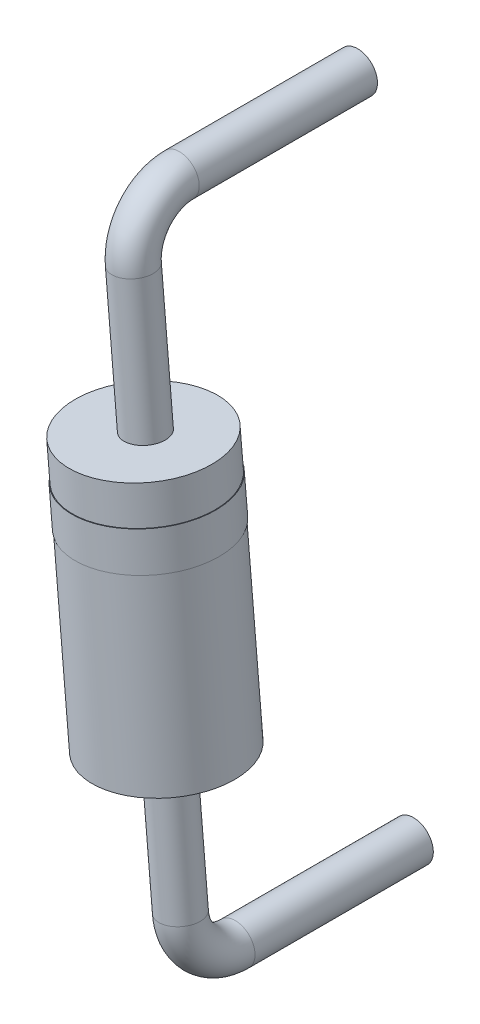
ISO-10303-21;
HEADER;
FILE_DESCRIPTION(('STEP AP214'),'2;1');
FILE_NAME('part.step','',(''),(''),'','','');
FILE_SCHEMA(('AUTOMOTIVE_DESIGN { 1 0 10303 214 1 1 1 1 }'));
ENDSEC;
DATA;
#1=APPLICATION_CONTEXT('core data for automotive mechanical design processes');
#2=APPLICATION_PROTOCOL_DEFINITION('international standard','automotive_design',2000,#1);
#3=PRODUCT_CONTEXT('',#1,'mechanical');
#4=PRODUCT('Part','Part','',(#3));
#5=PRODUCT_RELATED_PRODUCT_CATEGORY('part','',(#4));
#6=PRODUCT_DEFINITION_FORMATION('','',#4);
#7=PRODUCT_DEFINITION_CONTEXT('part definition',#1,'design');
#8=PRODUCT_DEFINITION('design','',#6,#7);
#9=PRODUCT_DEFINITION_SHAPE('','',#8);
#10=(LENGTH_UNIT() NAMED_UNIT(*) SI_UNIT(.MILLI.,.METRE.));
#11=(NAMED_UNIT(*) PLANE_ANGLE_UNIT() SI_UNIT($,.RADIAN.));
#12=(NAMED_UNIT(*) SI_UNIT($,.STERADIAN.) SOLID_ANGLE_UNIT());
#13=UNCERTAINTY_MEASURE_WITH_UNIT(LENGTH_MEASURE(1.E-05),#10,'distance_accuracy_value','');
#14=(GEOMETRIC_REPRESENTATION_CONTEXT(3) GLOBAL_UNCERTAINTY_ASSIGNED_CONTEXT((#13)) GLOBAL_UNIT_ASSIGNED_CONTEXT((#10,
#11,#12)) REPRESENTATION_CONTEXT('',''));
#15=CARTESIAN_POINT('',(0.,0.,0.));
#16=DIRECTION('',(0.,0.,1.));
#17=DIRECTION('',(1.,0.,0.));
#18=AXIS2_PLACEMENT_3D('',#15,#16,#17);
#19=CARTESIAN_POINT('',(51.2695777301861,25.7935231219083,0.3727));
#20=DIRECTION('',(0.996194698091747,0.087155742747638,0.));
#21=DIRECTION('',(0.,0.,1.));
#22=AXIS2_PLACEMENT_3D('',#19,#20,#21);
#23=TOROIDAL_SURFACE('',#22,1.,0.3935);
#24=CARTESIAN_POINT('',(51.1824219874384,26.7897178200001,0.3727));
#25=DIRECTION('',(0.,0.,-1.));
#26=DIRECTION('',(-0.087155742747638,0.996194698091747,0.));
#27=AXIS2_PLACEMENT_3D('',#24,#25,#26);
#28=CIRCLE('',#27,0.3935);
#29=CARTESIAN_POINT('',(51.2167177722096,26.397715206301,0.3727));
#30=VERTEX_POINT('',#29);
#31=EDGE_CURVE('E20',#30,#30,#28,.T.);
#32=ORIENTED_EDGE('',*,*,#31,.F.);
#33=EDGE_LOOP('',(#32));
#34=FACE_BOUND('',#33,.T.);
#35=CARTESIAN_POINT('',(51.2695777301861,25.7935231219083,1.3727));
#36=DIRECTION('',(-0.087155742747638,0.996194698091747,0.));
#37=DIRECTION('',(0.,0.,1.));
#38=AXIS2_PLACEMENT_3D('',#35,#36,#37);
#39=CIRCLE('',#38,0.3935);
#40=CARTESIAN_POINT('',(51.2695777301861,25.7935231219083,0.9792));
#41=VERTEX_POINT('',#40);
#42=EDGE_CURVE('E11',#41,#41,#39,.T.);
#43=ORIENTED_EDGE('',*,*,#42,.T.);
#44=EDGE_LOOP('',(#43));
#45=FACE_BOUND('',#44,.T.);
#46=ADVANCED_FACE('F16',(#34,#45),#23,.T.);
#47=CARTESIAN_POINT('',(52.2021441775858,15.1342398523266,0.3727));
#48=DIRECTION('',(-0.996194698091747,-0.087155742747638,0.));
#49=DIRECTION('',(0.,0.,-1.));
#50=AXIS2_PLACEMENT_3D('',#47,#48,#49);
#51=TOROIDAL_SURFACE('',#50,1.,0.3935);
#52=CARTESIAN_POINT('',(52.2892999203334,14.1380451542348,0.3727));
#53=DIRECTION('',(0.,0.,-1.));
#54=DIRECTION('',(-0.0871557427476379,0.996194698091747,0.));
#55=AXIS2_PLACEMENT_3D('',#52,#53,#54);
#56=CIRCLE('',#55,0.3935);
#57=CARTESIAN_POINT('',(52.2550041355622,14.5300477679339,0.3727));
#58=VERTEX_POINT('',#57);
#59=EDGE_CURVE('E108',#58,#58,#56,.T.);
#60=ORIENTED_EDGE('',*,*,#59,.F.);
#61=EDGE_LOOP('',(#60));
#62=FACE_BOUND('',#61,.T.);
#63=CARTESIAN_POINT('',(52.2021441775858,15.1342398523266,1.3727));
#64=DIRECTION('',(0.087155742747638,-0.996194698091747,0.));
#65=DIRECTION('',(0.,0.,-1.));
#66=AXIS2_PLACEMENT_3D('',#63,#64,#65);
#67=CIRCLE('',#66,0.3935);
#68=CARTESIAN_POINT('',(52.2021441775858,15.1342398523266,0.9792));
#69=VERTEX_POINT('',#68);
#70=EDGE_CURVE('E27',#69,#69,#67,.T.);
#71=ORIENTED_EDGE('',*,*,#70,.T.);
#72=EDGE_LOOP('',(#71));
#73=FACE_BOUND('',#72,.T.);
#74=ADVANCED_FACE('F148',(#62,#73),#51,.T.);
#75=CARTESIAN_POINT('',(52.2892999203334,14.1380451542348,0.0127000000000011));
#76=DIRECTION('',(0.,0.,-1.));
#77=DIRECTION('',(-0.0871557427476379,0.996194698091747,0.));
#78=AXIS2_PLACEMENT_3D('',#75,#76,#77);
#79=CYLINDRICAL_SURFACE('',#78,0.3935);
#80=ORIENTED_EDGE('',*,*,#59,.T.);
#81=EDGE_LOOP('',(#80));
#82=FACE_BOUND('',#81,.T.);
#83=CARTESIAN_POINT('',(52.2892999203334,14.1380451542348,-3.1623));
#84=DIRECTION('',(0.,0.,1.));
#85=DIRECTION('',(-0.0871557427476379,0.996194698091747,0.));
#86=AXIS2_PLACEMENT_3D('',#83,#84,#85);
#87=CIRCLE('',#86,0.3935);
#88=CARTESIAN_POINT('',(52.2550041355622,14.5300477679339,-3.1623));
#89=VERTEX_POINT('',#88);
#90=EDGE_CURVE('E111',#89,#89,#87,.T.);
#91=ORIENTED_EDGE('',*,*,#90,.T.);
#92=EDGE_LOOP('',(#91));
#93=FACE_BOUND('',#92,.T.);
#94=ADVANCED_FACE('F143',(#82,#93),#79,.T.);
#95=CARTESIAN_POINT('',(51.1824219874384,26.7897178200001,0.0127000000000011));
#96=DIRECTION('',(0.,0.,-1.));
#97=DIRECTION('',(-0.087155742747638,0.996194698091747,0.));
#98=AXIS2_PLACEMENT_3D('',#95,#96,#97);
#99=CYLINDRICAL_SURFACE('',#98,0.3935);
#100=ORIENTED_EDGE('',*,*,#31,.T.);
#101=EDGE_LOOP('',(#100));
#102=FACE_BOUND('',#101,.T.);
#103=CARTESIAN_POINT('',(51.1824219874384,26.7897178200001,-3.1623));
#104=DIRECTION('',(0.,0.,1.));
#105=DIRECTION('',(-0.087155742747638,0.996194698091747,0.));
#106=AXIS2_PLACEMENT_3D('',#103,#104,#105);
#107=CIRCLE('',#106,0.3935);
#108=CARTESIAN_POINT('',(51.1481262026672,27.1817204336992,-3.1623));
#109=VERTEX_POINT('',#108);
#110=EDGE_CURVE('E192',#109,#109,#107,.T.);
#111=ORIENTED_EDGE('',*,*,#110,.T.);
#112=EDGE_LOOP('',(#111));
#113=FACE_BOUND('',#112,.T.);
#114=ADVANCED_FACE('F134',(#102,#113),#99,.T.);
#115=CARTESIAN_POINT('',(51.7361659989855,20.4603948056741,1.4127));
#116=DIRECTION('',(-0.087155742747638,0.996194698091747,0.));
#117=DIRECTION('',(0.,0.,1.));
#118=AXIS2_PLACEMENT_3D('',#115,#116,#117);
#119=CYLINDRICAL_SURFACE('',#118,1.36);
#120=CARTESIAN_POINT('',(51.574696211394,22.3060029231616,1.4127));
#121=DIRECTION('',(-0.087155742747638,0.996194698091747,0.));
#122=DIRECTION('',(0.,0.,1.));
#123=AXIS2_PLACEMENT_3D('',#120,#121,#122);
#124=CIRCLE('',#123,1.36);
#125=CARTESIAN_POINT('',(51.574696211394,22.3060029231616,0.052700000000001));
#126=VERTEX_POINT('',#125);
#127=EDGE_CURVE('E197',#126,#126,#124,.T.);
#128=ORIENTED_EDGE('',*,*,#127,.T.);
#129=EDGE_LOOP('',(#128));
#130=FACE_BOUND('',#129,.T.);
#131=CARTESIAN_POINT('',(51.5092560227421,23.053987702156,1.4127));
#132=DIRECTION('',(-0.087155742747638,0.996194698091747,0.));
#133=DIRECTION('',(0.,0.,1.));
#134=AXIS2_PLACEMENT_3D('',#131,#132,#133);
#135=CIRCLE('',#134,1.36);
#136=CARTESIAN_POINT('',(51.5092560227421,23.053987702156,2.7727));
#137=VERTEX_POINT('',#136);
#138=EDGE_CURVE('E104',#137,#137,#135,.T.);
#139=ORIENTED_EDGE('',*,*,#138,.F.);
#140=EDGE_LOOP('',(#139));
#141=FACE_BOUND('',#140,.T.);
#142=ADVANCED_FACE('F131',(#130,#141),#119,.T.);
#143=CARTESIAN_POINT('',(51.7361659989855,20.4603948056741,1.4127));
#144=DIRECTION('',(-0.087155742747638,0.996194698091747,0.));
#145=DIRECTION('',(0.,0.,1.));
#146=AXIS2_PLACEMENT_3D('',#143,#144,#145);
#147=CYLINDRICAL_SURFACE('',#146,1.36);
#148=CARTESIAN_POINT('',(51.963075975229,17.8668019091923,1.4127));
#149=DIRECTION('',(-0.087155742747638,0.996194698091747,0.));
#150=DIRECTION('',(0.,0.,1.));
#151=AXIS2_PLACEMENT_3D('',#148,#149,#150);
#152=CIRCLE('',#151,1.36);
#153=CARTESIAN_POINT('',(51.963075975229,17.8668019091923,0.052700000000001));
#154=VERTEX_POINT('',#153);
#155=EDGE_CURVE('E202',#154,#154,#152,.T.);
#156=ORIENTED_EDGE('',*,*,#155,.T.);
#157=EDGE_LOOP('',(#156));
#158=FACE_BOUND('',#157,.T.);
#159=CARTESIAN_POINT('',(51.6416119848839,21.5411521322926,1.4127));
#160=DIRECTION('',(0.087155742747638,-0.996194698091747,0.));
#161=DIRECTION('',(0.,0.,1.));
#162=AXIS2_PLACEMENT_3D('',#159,#160,#161);
#163=CIRCLE('',#162,1.36);
#164=CARTESIAN_POINT('',(51.6416119848839,21.5411521322926,2.7727));
#165=VERTEX_POINT('',#164);
#166=EDGE_CURVE('E122',#165,#165,#163,.T.);
#167=ORIENTED_EDGE('',*,*,#166,.T.);
#168=EDGE_LOOP('',(#167));
#169=FACE_BOUND('',#168,.T.);
#170=ADVANCED_FACE('F133',(#158,#169),#147,.T.);
#171=CARTESIAN_POINT('',(51.6081540981389,21.9235775277276,1.4127));
#172=DIRECTION('',(-0.0871557427476379,0.996194698091747,0.));
#173=DIRECTION('',(0.,0.,1.));
#174=AXIS2_PLACEMENT_3D('',#171,#172,#173);
#175=CYLINDRICAL_SURFACE('',#174,1.373119036377);
#176=CARTESIAN_POINT('',(51.6416119848839,21.5411521322926,1.4127));
#177=DIRECTION('',(-0.0871557427476379,0.996194698091747,0.));
#178=DIRECTION('',(0.,0.,1.));
#179=AXIS2_PLACEMENT_3D('',#176,#177,#178);
#180=CIRCLE('',#179,1.373119036377);
#181=CARTESIAN_POINT('',(51.6416119848839,21.5411521322926,0.0395809636230011));
#182=VERTEX_POINT('',#181);
#183=EDGE_CURVE('E115',#182,#182,#180,.T.);
#184=ORIENTED_EDGE('',*,*,#183,.T.);
#185=EDGE_LOOP('',(#184));
#186=FACE_BOUND('',#185,.T.);
#187=CARTESIAN_POINT('',(51.574696211394,22.3060029231616,1.4127));
#188=DIRECTION('',(-0.0871557427476379,0.996194698091747,0.));
#189=DIRECTION('',(0.,0.,1.));
#190=AXIS2_PLACEMENT_3D('',#187,#188,#189);
#191=CIRCLE('',#190,1.373119036377);
#192=CARTESIAN_POINT('',(51.574696211394,22.3060029231616,2.785819036377));
#193=VERTEX_POINT('',#192);
#194=EDGE_CURVE('E112',#193,#193,#191,.T.);
#195=ORIENTED_EDGE('',*,*,#194,.F.);
#196=EDGE_LOOP('',(#195));
#197=FACE_BOUND('',#196,.T.);
#198=ADVANCED_FACE('F18',(#186,#197),#175,.T.);
#199=CARTESIAN_POINT('',(51.2695777301861,25.7935231219083,1.3727));
#200=DIRECTION('',(0.087155742747638,-0.996194698091747,0.));
#201=DIRECTION('',(0.,0.,1.));
#202=AXIS2_PLACEMENT_3D('',#199,#200,#201);
#203=CYLINDRICAL_SURFACE('',#202,0.3935);
#204=ORIENTED_EDGE('',*,*,#42,.F.);
#205=EDGE_LOOP('',(#204));
#206=FACE_BOUND('',#205,.T.);
#207=CARTESIAN_POINT('',(51.5092560227421,23.053987702156,1.3727));
#208=DIRECTION('',(0.087155742747638,-0.996194698091747,0.));
#209=DIRECTION('',(0.,0.,1.));
#210=AXIS2_PLACEMENT_3D('',#207,#208,#209);
#211=CIRCLE('',#210,0.3935);
#212=CARTESIAN_POINT('',(51.5092560227421,23.053987702156,1.7662));
#213=VERTEX_POINT('',#212);
#214=EDGE_CURVE('E87',#213,#213,#211,.T.);
#215=ORIENTED_EDGE('',*,*,#214,.F.);
#216=EDGE_LOOP('',(#215));
#217=FACE_BOUND('',#216,.T.);
#218=ADVANCED_FACE('F164',(#206,#217),#203,.T.);
#219=CARTESIAN_POINT('',(52.2021441775858,15.1342398523266,1.3727));
#220=DIRECTION('',(-0.087155742747638,0.996194698091747,0.));
#221=DIRECTION('',(0.,0.,-1.));
#222=AXIS2_PLACEMENT_3D('',#219,#220,#221);
#223=CYLINDRICAL_SURFACE('',#222,0.3935);
#224=ORIENTED_EDGE('',*,*,#70,.F.);
#225=EDGE_LOOP('',(#224));
#226=FACE_BOUND('',#225,.T.);
#227=CARTESIAN_POINT('',(51.963075975229,17.8668019091923,1.3727));
#228=DIRECTION('',(-0.087155742747638,0.996194698091747,0.));
#229=DIRECTION('',(0.,0.,-1.));
#230=AXIS2_PLACEMENT_3D('',#227,#228,#229);
#231=CIRCLE('',#230,0.3935);
#232=CARTESIAN_POINT('',(51.963075975229,17.8668019091923,0.9792));
#233=VERTEX_POINT('',#232);
#234=EDGE_CURVE('E94',#233,#233,#231,.T.);
#235=ORIENTED_EDGE('',*,*,#234,.F.);
#236=EDGE_LOOP('',(#235));
#237=FACE_BOUND('',#236,.T.);
#238=ADVANCED_FACE('F95',(#226,#237),#223,.T.);
#239=CARTESIAN_POINT('',(51.574696211394,22.3060029231616,2.742178349446));
#240=DIRECTION('',(-0.087155742747638,0.996194698091747,0.));
#241=DIRECTION('',(0.,0.,1.));
#242=AXIS2_PLACEMENT_3D('',#239,#240,#241);
#243=PLANE('',#242);
#244=ORIENTED_EDGE('',*,*,#194,.T.);
#245=EDGE_LOOP('',(#244));
#246=FACE_BOUND('',#245,.T.);
#247=ORIENTED_EDGE('',*,*,#127,.F.);
#248=EDGE_LOOP('',(#247));
#249=FACE_BOUND('',#248,.T.);
#250=ADVANCED_FACE('F158',(#246,#249),#243,.T.);
#251=CARTESIAN_POINT('',(51.6416119848839,21.5411521322926,2.742178349446));
#252=DIRECTION('',(0.087155742747638,-0.996194698091747,0.));
#253=DIRECTION('',(0.996194698091747,0.087155742747638,0.));
#254=AXIS2_PLACEMENT_3D('',#251,#252,#253);
#255=PLANE('',#254);
#256=ORIENTED_EDGE('',*,*,#183,.F.);
#257=EDGE_LOOP('',(#256));
#258=FACE_BOUND('',#257,.T.);
#259=ORIENTED_EDGE('',*,*,#166,.F.);
#260=EDGE_LOOP('',(#259));
#261=FACE_BOUND('',#260,.T.);
#262=ADVANCED_FACE('F175',(#258,#261),#255,.T.);
#263=CARTESIAN_POINT('',(51.5092560227421,23.053987702156,2.0927));
#264=DIRECTION('',(-0.087155742747638,0.996194698091747,0.));
#265=DIRECTION('',(0.,0.,1.));
#266=AXIS2_PLACEMENT_3D('',#263,#264,#265);
#267=PLANE('',#266);
#268=ORIENTED_EDGE('',*,*,#138,.T.);
#269=EDGE_LOOP('',(#268));
#270=FACE_BOUND('',#269,.T.);
#271=ORIENTED_EDGE('',*,*,#214,.T.);
#272=EDGE_LOOP('',(#271));
#273=FACE_BOUND('',#272,.T.);
#274=ADVANCED_FACE('F128',(#270,#273),#267,.T.);
#275=CARTESIAN_POINT('',(51.963075975229,17.8668019091923,2.0927));
#276=DIRECTION('',(0.087155742747638,-0.996194698091747,0.));
#277=DIRECTION('',(0.996194698091747,0.087155742747638,0.));
#278=AXIS2_PLACEMENT_3D('',#275,#276,#277);
#279=PLANE('',#278);
#280=ORIENTED_EDGE('',*,*,#155,.F.);
#281=EDGE_LOOP('',(#280));
#282=FACE_BOUND('',#281,.T.);
#283=ORIENTED_EDGE('',*,*,#234,.T.);
#284=EDGE_LOOP('',(#283));
#285=FACE_BOUND('',#284,.T.);
#286=ADVANCED_FACE('F159',(#282,#285),#279,.T.);
#287=CARTESIAN_POINT('',(51.1824219874384,26.7897178200001,-3.1623));
#288=DIRECTION('',(0.,0.,-1.));
#289=DIRECTION('',(-0.996194698091747,-0.0871557427476379,0.));
#290=AXIS2_PLACEMENT_3D('',#287,#288,#289);
#291=PLANE('',#290);
#292=ORIENTED_EDGE('',*,*,#110,.F.);
#293=EDGE_LOOP('',(#292));
#294=FACE_BOUND('',#293,.T.);
#295=ADVANCED_FACE('F162',(#294),#291,.T.);
#296=CARTESIAN_POINT('',(52.2892999203334,14.1380451542348,-3.1623));
#297=DIRECTION('',(0.,0.,-1.));
#298=DIRECTION('',(-0.996194698091747,-0.0871557427476379,0.));
#299=AXIS2_PLACEMENT_3D('',#296,#297,#298);
#300=PLANE('',#299);
#301=ORIENTED_EDGE('',*,*,#90,.F.);
#302=EDGE_LOOP('',(#301));
#303=FACE_BOUND('',#302,.T.);
#304=ADVANCED_FACE('F173',(#303),#300,.T.);
#305=CLOSED_SHELL('',(#46,#74,#94,#114,#142,#170,#198,#218,#238,#250,#262,#274,#286,#295,#304));
#306=MANIFOLD_SOLID_BREP('B1',#305);
#307=ADVANCED_BREP_SHAPE_REPRESENTATION('',(#18,#306),#14);
#308=SHAPE_DEFINITION_REPRESENTATION(#9,#307);
ENDSEC;
END-ISO-10303-21;
